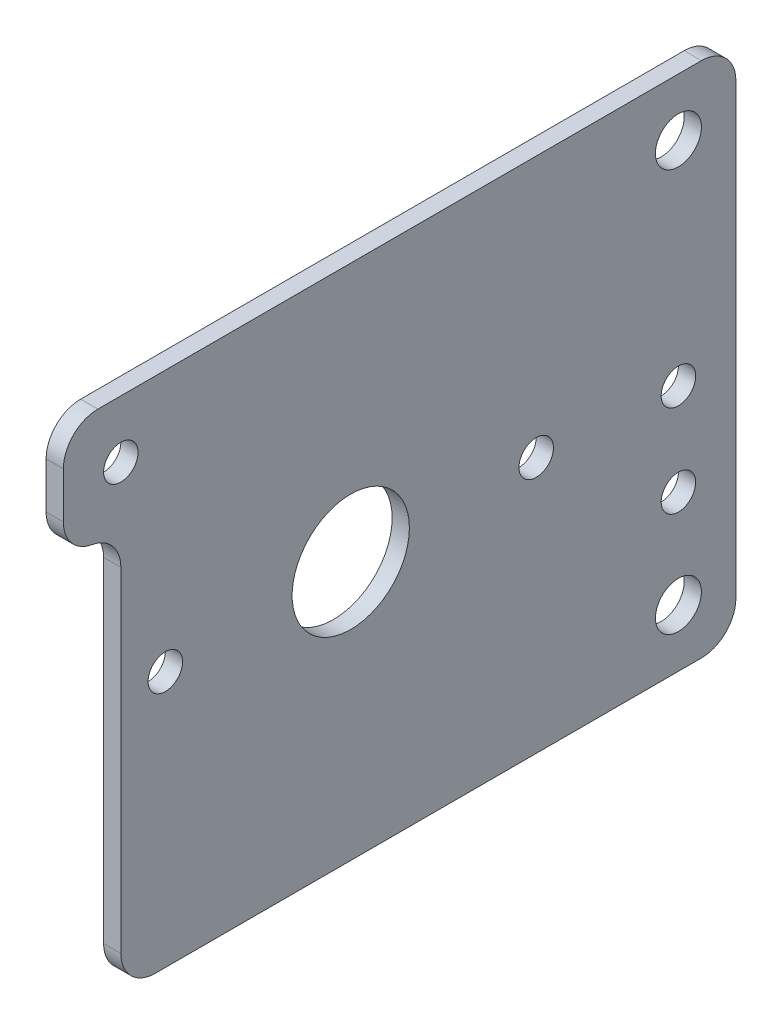
ISO-10303-21;
HEADER;
FILE_DESCRIPTION(('STEP AP214'),'2;1');
FILE_NAME('part.step','',(''),(''),'','','');
FILE_SCHEMA(('AUTOMOTIVE_DESIGN { 1 0 10303 214 1 1 1 1 }'));
ENDSEC;
DATA;
#1=APPLICATION_CONTEXT('core data for automotive mechanical design processes');
#2=APPLICATION_PROTOCOL_DEFINITION('international standard','automotive_design',2000,#1);
#3=PRODUCT_CONTEXT('',#1,'mechanical');
#4=PRODUCT('Part','Part','',(#3));
#5=PRODUCT_RELATED_PRODUCT_CATEGORY('part','',(#4));
#6=PRODUCT_DEFINITION_FORMATION('','',#4);
#7=PRODUCT_DEFINITION_CONTEXT('part definition',#1,'design');
#8=PRODUCT_DEFINITION('design','',#6,#7);
#9=PRODUCT_DEFINITION_SHAPE('','',#8);
#10=(LENGTH_UNIT() NAMED_UNIT(*) SI_UNIT(.MILLI.,.METRE.));
#11=(NAMED_UNIT(*) PLANE_ANGLE_UNIT() SI_UNIT($,.RADIAN.));
#12=(NAMED_UNIT(*) SI_UNIT($,.STERADIAN.) SOLID_ANGLE_UNIT());
#13=UNCERTAINTY_MEASURE_WITH_UNIT(LENGTH_MEASURE(1.E-05),#10,'distance_accuracy_value','');
#14=(GEOMETRIC_REPRESENTATION_CONTEXT(3) GLOBAL_UNCERTAINTY_ASSIGNED_CONTEXT((#13)) GLOBAL_UNIT_ASSIGNED_CONTEXT((#10,
#11,#12)) REPRESENTATION_CONTEXT('',''));
#15=CARTESIAN_POINT('',(0.,0.,0.));
#16=DIRECTION('',(0.,0.,1.));
#17=DIRECTION('',(1.,0.,0.));
#18=AXIS2_PLACEMENT_3D('',#15,#16,#17);
#19=CARTESIAN_POINT('',(1.5,-22.5,26.75));
#20=DIRECTION('',(0.,0.,-1.));
#21=DIRECTION('',(-1.,0.,0.));
#22=AXIS2_PLACEMENT_3D('',#19,#20,#21);
#23=PLANE('',#22);
#24=DIRECTION('',(0.,-1.,0.));
#25=VECTOR('',#24,1.);
#26=CARTESIAN_POINT('',(1.5,-22.5,26.75));
#27=LINE('',#26,#25);
#28=CARTESIAN_POINT('',(1.5,9.58392021690037,26.75));
#29=VERTEX_POINT('',#28);
#30=CARTESIAN_POINT('',(1.5,-19.5,26.75));
#31=VERTEX_POINT('',#30);
#32=EDGE_CURVE('E207',#29,#31,#27,.T.);
#33=ORIENTED_EDGE('',*,*,#32,.F.);
#34=DIRECTION('',(1.,0.,0.));
#35=VECTOR('',#34,1.);
#36=CARTESIAN_POINT('',(1.5,9.58392021690039,26.75));
#37=LINE('',#36,#35);
#38=CARTESIAN_POINT('',(0.,9.58392021690037,26.75));
#39=VERTEX_POINT('',#38);
#40=EDGE_CURVE('E56',#29,#39,#37,.F.);
#41=ORIENTED_EDGE('',*,*,#40,.T.);
#42=DIRECTION('',(0.,-1.,0.));
#43=VECTOR('',#42,1.);
#44=CARTESIAN_POINT('',(0.,-22.5,26.75));
#45=LINE('',#44,#43);
#46=CARTESIAN_POINT('',(0.,-19.5,26.75));
#47=VERTEX_POINT('',#46);
#48=EDGE_CURVE('E197',#39,#47,#45,.T.);
#49=ORIENTED_EDGE('',*,*,#48,.T.);
#50=DIRECTION('',(-1.,0.,0.));
#51=VECTOR('',#50,1.);
#52=CARTESIAN_POINT('',(1.5,-19.5,26.75));
#53=LINE('',#52,#51);
#54=EDGE_CURVE('E170',#47,#31,#53,.F.);
#55=ORIENTED_EDGE('',*,*,#54,.T.);
#56=EDGE_LOOP('',(#33,#41,#49,#55));
#57=FACE_BOUND('',#56,.T.);
#58=ADVANCED_FACE('F35',(#57),#23,.F.);
#59=CARTESIAN_POINT('',(1.5,0.,0.));
#60=DIRECTION('',(-1.,0.,0.));
#61=DIRECTION('',(0.,0.,1.));
#62=AXIS2_PLACEMENT_3D('',#59,#60,#61);
#63=PLANE('',#62);
#64=CARTESIAN_POINT('',(1.5,17.5,26.75));
#65=DIRECTION('',(1.,0.,0.));
#66=DIRECTION('',(0.,0.,-1.));
#67=AXIS2_PLACEMENT_3D('',#64,#65,#66);
#68=CIRCLE('',#67,1.5);
#69=CARTESIAN_POINT('',(1.5,17.5,25.25));
#70=VERTEX_POINT('',#69);
#71=EDGE_CURVE('E256',#70,#70,#68,.T.);
#72=ORIENTED_EDGE('',*,*,#71,.F.);
#73=EDGE_LOOP('',(#72));
#74=FACE_BOUND('',#73,.T.);
#75=DIRECTION('',(0.,-1.,0.));
#76=VECTOR('',#75,1.);
#77=CARTESIAN_POINT('',(1.5,12.5,31.75));
#78=LINE('',#77,#76);
#79=CARTESIAN_POINT('',(1.5,19.5,31.75));
#80=VERTEX_POINT('',#79);
#81=CARTESIAN_POINT('',(1.5,15.5,31.75));
#82=VERTEX_POINT('',#81);
#83=EDGE_CURVE('E124',#80,#82,#78,.T.);
#84=ORIENTED_EDGE('',*,*,#83,.T.);
#85=CARTESIAN_POINT('',(1.5,15.5,28.75));
#86=DIRECTION('',(-1.,0.,0.));
#87=DIRECTION('',(0.,0.,1.));
#88=AXIS2_PLACEMENT_3D('',#85,#86,#87);
#89=CIRCLE('',#88,3.);
#90=CARTESIAN_POINT('',(1.5,12.5419601084502,29.25));
#91=VERTEX_POINT('',#90);
#92=EDGE_CURVE('E150',#82,#91,#89,.F.);
#93=ORIENTED_EDGE('',*,*,#92,.T.);
#94=CARTESIAN_POINT('',(1.5,9.58392021690038,29.75));
#95=DIRECTION('',(-1.,0.,0.));
#96=DIRECTION('',(0.,0.,1.));
#97=AXIS2_PLACEMENT_3D('',#94,#95,#96);
#98=CIRCLE('',#97,3.);
#99=EDGE_CURVE('E43',#91,#29,#98,.T.);
#100=ORIENTED_EDGE('',*,*,#99,.T.);
#101=ORIENTED_EDGE('',*,*,#32,.T.);
#102=CARTESIAN_POINT('',(1.5,-19.5,23.75));
#103=DIRECTION('',(-1.,0.,0.));
#104=DIRECTION('',(0.,0.,1.));
#105=AXIS2_PLACEMENT_3D('',#102,#103,#104);
#106=CIRCLE('',#105,3.);
#107=CARTESIAN_POINT('',(1.5,-22.5,23.75));
#108=VERTEX_POINT('',#107);
#109=EDGE_CURVE('E184',#31,#108,#106,.F.);
#110=ORIENTED_EDGE('',*,*,#109,.T.);
#111=DIRECTION('',(0.,0.,-1.));
#112=VECTOR('',#111,1.);
#113=CARTESIAN_POINT('',(1.5,-22.5,26.75));
#114=LINE('',#113,#112);
#115=CARTESIAN_POINT('',(1.5,-22.5,-23.75));
#116=VERTEX_POINT('',#115);
#117=EDGE_CURVE('E128',#108,#116,#114,.T.);
#118=ORIENTED_EDGE('',*,*,#117,.T.);
#119=CARTESIAN_POINT('',(1.5,-19.5,-23.75));
#120=DIRECTION('',(-1.,0.,0.));
#121=DIRECTION('',(0.,0.,1.));
#122=AXIS2_PLACEMENT_3D('',#119,#120,#121);
#123=CIRCLE('',#122,3.);
#124=CARTESIAN_POINT('',(1.5,-19.5,-26.75));
#125=VERTEX_POINT('',#124);
#126=EDGE_CURVE('E190',#116,#125,#123,.F.);
#127=ORIENTED_EDGE('',*,*,#126,.T.);
#128=DIRECTION('',(0.,1.,0.));
#129=VECTOR('',#128,1.);
#130=CARTESIAN_POINT('',(1.5,-22.5,-26.75));
#131=LINE('',#130,#129);
#132=CARTESIAN_POINT('',(1.5,19.5,-26.75));
#133=VERTEX_POINT('',#132);
#134=EDGE_CURVE('E196',#125,#133,#131,.T.);
#135=ORIENTED_EDGE('',*,*,#134,.T.);
#136=CARTESIAN_POINT('',(1.5,19.5,-23.75));
#137=DIRECTION('',(-1.,0.,0.));
#138=DIRECTION('',(0.,0.,1.));
#139=AXIS2_PLACEMENT_3D('',#136,#137,#138);
#140=CIRCLE('',#139,3.);
#141=CARTESIAN_POINT('',(1.5,22.5,-23.75));
#142=VERTEX_POINT('',#141);
#143=EDGE_CURVE('E183',#133,#142,#140,.F.);
#144=ORIENTED_EDGE('',*,*,#143,.T.);
#145=DIRECTION('',(0.,0.,1.));
#146=VECTOR('',#145,1.);
#147=CARTESIAN_POINT('',(1.5,22.5,26.75));
#148=LINE('',#147,#146);
#149=CARTESIAN_POINT('',(1.5,22.5,28.75));
#150=VERTEX_POINT('',#149);
#151=EDGE_CURVE('E209',#142,#150,#148,.T.);
#152=ORIENTED_EDGE('',*,*,#151,.T.);
#153=CARTESIAN_POINT('',(1.5,19.5,28.75));
#154=DIRECTION('',(-1.,0.,0.));
#155=DIRECTION('',(0.,0.,1.));
#156=AXIS2_PLACEMENT_3D('',#153,#154,#155);
#157=CIRCLE('',#156,3.);
#158=EDGE_CURVE('E188',#150,#80,#157,.F.);
#159=ORIENTED_EDGE('',*,*,#158,.T.);
#160=EDGE_LOOP('',(#84,#93,#100,#101,#110,#118,#127,#135,#144,#152,#159));
#161=FACE_BOUND('',#160,.T.);
#162=CARTESIAN_POINT('',(1.5,0.,6.75000000000001));
#163=DIRECTION('',(1.,0.,0.));
#164=DIRECTION('',(0.,0.,-1.));
#165=AXIS2_PLACEMENT_3D('',#162,#163,#164);
#166=CIRCLE('',#165,5.1);
#167=CARTESIAN_POINT('',(1.5,0.,1.65));
#168=VERTEX_POINT('',#167);
#169=EDGE_CURVE('E204',#168,#168,#166,.T.);
#170=ORIENTED_EDGE('',*,*,#169,.F.);
#171=EDGE_LOOP('',(#170));
#172=FACE_BOUND('',#171,.T.);
#173=CARTESIAN_POINT('',(1.5,-0.210000000000023,22.88));
#174=DIRECTION('',(1.,0.,0.));
#175=DIRECTION('',(0.,0.,-1.));
#176=AXIS2_PLACEMENT_3D('',#173,#174,#175);
#177=CIRCLE('',#176,1.5);
#178=CARTESIAN_POINT('',(1.5,-0.210000000000023,21.38));
#179=VERTEX_POINT('',#178);
#180=EDGE_CURVE('E217',#179,#179,#177,.T.);
#181=ORIENTED_EDGE('',*,*,#180,.F.);
#182=EDGE_LOOP('',(#181));
#183=FACE_BOUND('',#182,.T.);
#184=CARTESIAN_POINT('',(1.5,-0.210000000000006,-9.38));
#185=DIRECTION('',(1.,0.,0.));
#186=DIRECTION('',(0.,0.,1.));
#187=AXIS2_PLACEMENT_3D('',#184,#185,#186);
#188=CIRCLE('',#187,1.5);
#189=CARTESIAN_POINT('',(1.5,-0.210000000000006,-7.87999999999999));
#190=VERTEX_POINT('',#189);
#191=EDGE_CURVE('E223',#190,#190,#188,.T.);
#192=ORIENTED_EDGE('',*,*,#191,.F.);
#193=EDGE_LOOP('',(#192));
#194=FACE_BOUND('',#193,.T.);
#195=CARTESIAN_POINT('',(1.5,17.5,-21.75));
#196=DIRECTION('',(1.,0.,0.));
#197=DIRECTION('',(0.,0.,-1.));
#198=AXIS2_PLACEMENT_3D('',#195,#196,#197);
#199=CIRCLE('',#198,2.00000000000001);
#200=CARTESIAN_POINT('',(1.5,17.5,-23.75));
#201=VERTEX_POINT('',#200);
#202=EDGE_CURVE('E229',#201,#201,#199,.T.);
#203=ORIENTED_EDGE('',*,*,#202,.F.);
#204=EDGE_LOOP('',(#203));
#205=FACE_BOUND('',#204,.T.);
#206=CARTESIAN_POINT('',(1.5,-17.5,-21.75));
#207=DIRECTION('',(1.,0.,0.));
#208=DIRECTION('',(0.,0.,1.));
#209=AXIS2_PLACEMENT_3D('',#206,#207,#208);
#210=CIRCLE('',#209,2.00000000000001);
#211=CARTESIAN_POINT('',(1.5,-17.5,-19.75));
#212=VERTEX_POINT('',#211);
#213=EDGE_CURVE('E235',#212,#212,#210,.T.);
#214=ORIENTED_EDGE('',*,*,#213,.F.);
#215=EDGE_LOOP('',(#214));
#216=FACE_BOUND('',#215,.T.);
#217=CARTESIAN_POINT('',(1.5,-0.999999999999997,-21.75));
#218=DIRECTION('',(1.,0.,0.));
#219=DIRECTION('',(0.,0.,-1.));
#220=AXIS2_PLACEMENT_3D('',#217,#218,#219);
#221=CIRCLE('',#220,1.5);
#222=CARTESIAN_POINT('',(1.5,-0.999999999999997,-23.25));
#223=VERTEX_POINT('',#222);
#224=EDGE_CURVE('E241',#223,#223,#221,.T.);
#225=ORIENTED_EDGE('',*,*,#224,.F.);
#226=EDGE_LOOP('',(#225));
#227=FACE_BOUND('',#226,.T.);
#228=CARTESIAN_POINT('',(1.5,-9.,-21.75));
#229=DIRECTION('',(1.,0.,0.));
#230=DIRECTION('',(0.,0.,-1.));
#231=AXIS2_PLACEMENT_3D('',#228,#229,#230);
#232=CIRCLE('',#231,1.5);
#233=CARTESIAN_POINT('',(1.5,-9.,-23.25));
#234=VERTEX_POINT('',#233);
#235=EDGE_CURVE('E247',#234,#234,#232,.T.);
#236=ORIENTED_EDGE('',*,*,#235,.F.);
#237=EDGE_LOOP('',(#236));
#238=FACE_BOUND('',#237,.T.);
#239=ADVANCED_FACE('F181',(#74,#161,#172,#183,#194,#205,#216,#227,#238),#63,.F.);
#240=CARTESIAN_POINT('',(0.,0.,0.));
#241=DIRECTION('',(-1.,0.,0.));
#242=DIRECTION('',(0.,0.,1.));
#243=AXIS2_PLACEMENT_3D('',#240,#241,#242);
#244=PLANE('',#243);
#245=CARTESIAN_POINT('',(0.,17.5,26.75));
#246=DIRECTION('',(1.,0.,0.));
#247=DIRECTION('',(0.,0.,-1.));
#248=AXIS2_PLACEMENT_3D('',#245,#246,#247);
#249=CIRCLE('',#248,1.5);
#250=CARTESIAN_POINT('',(0.,17.5,25.25));
#251=VERTEX_POINT('',#250);
#252=EDGE_CURVE('E255',#251,#251,#249,.T.);
#253=ORIENTED_EDGE('',*,*,#252,.T.);
#254=EDGE_LOOP('',(#253));
#255=FACE_BOUND('',#254,.T.);
#256=CARTESIAN_POINT('',(0.,-0.999999999999997,-21.75));
#257=DIRECTION('',(1.,0.,0.));
#258=DIRECTION('',(0.,0.,-1.));
#259=AXIS2_PLACEMENT_3D('',#256,#257,#258);
#260=CIRCLE('',#259,1.5);
#261=CARTESIAN_POINT('',(0.,-0.999999999999997,-23.25));
#262=VERTEX_POINT('',#261);
#263=EDGE_CURVE('E244',#262,#262,#260,.T.);
#264=ORIENTED_EDGE('',*,*,#263,.T.);
#265=EDGE_LOOP('',(#264));
#266=FACE_BOUND('',#265,.T.);
#267=CARTESIAN_POINT('',(0.,17.5,-21.75));
#268=DIRECTION('',(1.,0.,0.));
#269=DIRECTION('',(0.,0.,-1.));
#270=AXIS2_PLACEMENT_3D('',#267,#268,#269);
#271=CIRCLE('',#270,2.00000000000001);
#272=CARTESIAN_POINT('',(0.,17.5,-23.75));
#273=VERTEX_POINT('',#272);
#274=EDGE_CURVE('E232',#273,#273,#271,.T.);
#275=ORIENTED_EDGE('',*,*,#274,.T.);
#276=EDGE_LOOP('',(#275));
#277=FACE_BOUND('',#276,.T.);
#278=CARTESIAN_POINT('',(0.,-0.210000000000023,22.88));
#279=DIRECTION('',(1.,0.,0.));
#280=DIRECTION('',(0.,0.,-1.));
#281=AXIS2_PLACEMENT_3D('',#278,#279,#280);
#282=CIRCLE('',#281,1.5);
#283=CARTESIAN_POINT('',(0.,-0.210000000000023,21.38));
#284=VERTEX_POINT('',#283);
#285=EDGE_CURVE('E220',#284,#284,#282,.T.);
#286=ORIENTED_EDGE('',*,*,#285,.T.);
#287=EDGE_LOOP('',(#286));
#288=FACE_BOUND('',#287,.T.);
#289=ORIENTED_EDGE('',*,*,#48,.F.);
#290=CARTESIAN_POINT('',(0.,9.58392021690038,29.75));
#291=DIRECTION('',(-1.,0.,0.));
#292=DIRECTION('',(0.,0.,1.));
#293=AXIS2_PLACEMENT_3D('',#290,#291,#292);
#294=CIRCLE('',#293,3.);
#295=CARTESIAN_POINT('',(0.,12.5419601084502,29.25));
#296=VERTEX_POINT('',#295);
#297=EDGE_CURVE('E11',#39,#296,#294,.F.);
#298=ORIENTED_EDGE('',*,*,#297,.T.);
#299=CARTESIAN_POINT('',(0.,15.5,28.75));
#300=DIRECTION('',(-1.,0.,0.));
#301=DIRECTION('',(0.,0.,1.));
#302=AXIS2_PLACEMENT_3D('',#299,#300,#301);
#303=CIRCLE('',#302,3.);
#304=CARTESIAN_POINT('',(0.,15.5,31.75));
#305=VERTEX_POINT('',#304);
#306=EDGE_CURVE('E137',#296,#305,#303,.T.);
#307=ORIENTED_EDGE('',*,*,#306,.T.);
#308=DIRECTION('',(0.,-1.,0.));
#309=VECTOR('',#308,1.);
#310=CARTESIAN_POINT('',(0.,12.5,31.75));
#311=LINE('',#310,#309);
#312=CARTESIAN_POINT('',(0.,19.5,31.75));
#313=VERTEX_POINT('',#312);
#314=EDGE_CURVE('E121',#313,#305,#311,.T.);
#315=ORIENTED_EDGE('',*,*,#314,.F.);
#316=CARTESIAN_POINT('',(0.,19.5,28.75));
#317=DIRECTION('',(-1.,0.,0.));
#318=DIRECTION('',(0.,0.,1.));
#319=AXIS2_PLACEMENT_3D('',#316,#317,#318);
#320=CIRCLE('',#319,3.);
#321=CARTESIAN_POINT('',(0.,22.5,28.75));
#322=VERTEX_POINT('',#321);
#323=EDGE_CURVE('E134',#313,#322,#320,.T.);
#324=ORIENTED_EDGE('',*,*,#323,.T.);
#325=DIRECTION('',(0.,0.,1.));
#326=VECTOR('',#325,1.);
#327=CARTESIAN_POINT('',(0.,22.5,26.75));
#328=LINE('',#327,#326);
#329=CARTESIAN_POINT('',(0.,22.5,-23.75));
#330=VERTEX_POINT('',#329);
#331=EDGE_CURVE('E199',#330,#322,#328,.T.);
#332=ORIENTED_EDGE('',*,*,#331,.F.);
#333=CARTESIAN_POINT('',(0.,19.5,-23.75));
#334=DIRECTION('',(-1.,0.,0.));
#335=DIRECTION('',(0.,0.,1.));
#336=AXIS2_PLACEMENT_3D('',#333,#334,#335);
#337=CIRCLE('',#336,3.);
#338=CARTESIAN_POINT('',(0.,19.5,-26.75));
#339=VERTEX_POINT('',#338);
#340=EDGE_CURVE('E148',#330,#339,#337,.T.);
#341=ORIENTED_EDGE('',*,*,#340,.T.);
#342=DIRECTION('',(0.,1.,0.));
#343=VECTOR('',#342,1.);
#344=CARTESIAN_POINT('',(0.,-22.5,-26.75));
#345=LINE('',#344,#343);
#346=CARTESIAN_POINT('',(0.,-19.5,-26.75));
#347=VERTEX_POINT('',#346);
#348=EDGE_CURVE('E201',#347,#339,#345,.T.);
#349=ORIENTED_EDGE('',*,*,#348,.F.);
#350=CARTESIAN_POINT('',(0.,-19.5,-23.75));
#351=DIRECTION('',(-1.,0.,0.));
#352=DIRECTION('',(0.,0.,1.));
#353=AXIS2_PLACEMENT_3D('',#350,#351,#352);
#354=CIRCLE('',#353,3.);
#355=CARTESIAN_POINT('',(0.,-22.5,-23.75));
#356=VERTEX_POINT('',#355);
#357=EDGE_CURVE('E145',#347,#356,#354,.T.);
#358=ORIENTED_EDGE('',*,*,#357,.T.);
#359=DIRECTION('',(0.,0.,-1.));
#360=VECTOR('',#359,1.);
#361=CARTESIAN_POINT('',(0.,-22.5,26.75));
#362=LINE('',#361,#360);
#363=CARTESIAN_POINT('',(0.,-22.5,23.75));
#364=VERTEX_POINT('',#363);
#365=EDGE_CURVE('E193',#364,#356,#362,.T.);
#366=ORIENTED_EDGE('',*,*,#365,.F.);
#367=CARTESIAN_POINT('',(0.,-19.5,23.75));
#368=DIRECTION('',(-1.,0.,0.));
#369=DIRECTION('',(0.,0.,1.));
#370=AXIS2_PLACEMENT_3D('',#367,#368,#369);
#371=CIRCLE('',#370,3.);
#372=EDGE_CURVE('E144',#364,#47,#371,.T.);
#373=ORIENTED_EDGE('',*,*,#372,.T.);
#374=EDGE_LOOP('',(#289,#298,#307,#315,#324,#332,#341,#349,#358,#366,#373));
#375=FACE_BOUND('',#374,.T.);
#376=CARTESIAN_POINT('',(0.,0.,6.75000000000001));
#377=DIRECTION('',(1.,0.,0.));
#378=DIRECTION('',(0.,0.,-1.));
#379=AXIS2_PLACEMENT_3D('',#376,#377,#378);
#380=CIRCLE('',#379,5.1);
#381=CARTESIAN_POINT('',(0.,0.,1.65));
#382=VERTEX_POINT('',#381);
#383=EDGE_CURVE('E214',#382,#382,#380,.T.);
#384=ORIENTED_EDGE('',*,*,#383,.T.);
#385=EDGE_LOOP('',(#384));
#386=FACE_BOUND('',#385,.T.);
#387=CARTESIAN_POINT('',(0.,-0.210000000000006,-9.38));
#388=DIRECTION('',(1.,0.,0.));
#389=DIRECTION('',(0.,0.,1.));
#390=AXIS2_PLACEMENT_3D('',#387,#388,#389);
#391=CIRCLE('',#390,1.5);
#392=CARTESIAN_POINT('',(0.,-0.210000000000006,-7.87999999999999));
#393=VERTEX_POINT('',#392);
#394=EDGE_CURVE('E226',#393,#393,#391,.T.);
#395=ORIENTED_EDGE('',*,*,#394,.T.);
#396=EDGE_LOOP('',(#395));
#397=FACE_BOUND('',#396,.T.);
#398=CARTESIAN_POINT('',(0.,-17.5,-21.75));
#399=DIRECTION('',(1.,0.,0.));
#400=DIRECTION('',(0.,0.,1.));
#401=AXIS2_PLACEMENT_3D('',#398,#399,#400);
#402=CIRCLE('',#401,2.00000000000001);
#403=CARTESIAN_POINT('',(0.,-17.5,-19.75));
#404=VERTEX_POINT('',#403);
#405=EDGE_CURVE('E238',#404,#404,#402,.T.);
#406=ORIENTED_EDGE('',*,*,#405,.T.);
#407=EDGE_LOOP('',(#406));
#408=FACE_BOUND('',#407,.T.);
#409=CARTESIAN_POINT('',(0.,-9.,-21.75));
#410=DIRECTION('',(1.,0.,0.));
#411=DIRECTION('',(0.,0.,-1.));
#412=AXIS2_PLACEMENT_3D('',#409,#410,#411);
#413=CIRCLE('',#412,1.5);
#414=CARTESIAN_POINT('',(0.,-9.,-23.25));
#415=VERTEX_POINT('',#414);
#416=EDGE_CURVE('E138',#415,#415,#413,.T.);
#417=ORIENTED_EDGE('',*,*,#416,.T.);
#418=EDGE_LOOP('',(#417));
#419=FACE_BOUND('',#418,.T.);
#420=ADVANCED_FACE('F131',(#255,#266,#277,#288,#375,#386,#397,#408,#419),#244,.T.);
#421=CARTESIAN_POINT('',(1.5,-22.5,-26.75));
#422=DIRECTION('',(0.,0.,1.));
#423=DIRECTION('',(1.,0.,0.));
#424=AXIS2_PLACEMENT_3D('',#421,#422,#423);
#425=PLANE('',#424);
#426=ORIENTED_EDGE('',*,*,#348,.T.);
#427=DIRECTION('',(-1.,0.,0.));
#428=VECTOR('',#427,1.);
#429=CARTESIAN_POINT('',(1.5,19.5,-26.75));
#430=LINE('',#429,#428);
#431=EDGE_CURVE('E163',#339,#133,#430,.F.);
#432=ORIENTED_EDGE('',*,*,#431,.T.);
#433=ORIENTED_EDGE('',*,*,#134,.F.);
#434=DIRECTION('',(-1.,0.,0.));
#435=VECTOR('',#434,1.);
#436=CARTESIAN_POINT('',(1.5,-19.5,-26.75));
#437=LINE('',#436,#435);
#438=EDGE_CURVE('E160',#125,#347,#437,.T.);
#439=ORIENTED_EDGE('',*,*,#438,.T.);
#440=EDGE_LOOP('',(#426,#432,#433,#439));
#441=FACE_BOUND('',#440,.T.);
#442=ADVANCED_FACE('F276',(#441),#425,.F.);
#443=CARTESIAN_POINT('',(1.5,22.5,26.75));
#444=DIRECTION('',(0.,-1.,0.));
#445=DIRECTION('',(0.,0.,-1.));
#446=AXIS2_PLACEMENT_3D('',#443,#444,#445);
#447=PLANE('',#446);
#448=ORIENTED_EDGE('',*,*,#151,.F.);
#449=DIRECTION('',(-1.,0.,0.));
#450=VECTOR('',#449,1.);
#451=CARTESIAN_POINT('',(1.5,22.5,-23.75));
#452=LINE('',#451,#450);
#453=EDGE_CURVE('E157',#142,#330,#452,.T.);
#454=ORIENTED_EDGE('',*,*,#453,.T.);
#455=ORIENTED_EDGE('',*,*,#331,.T.);
#456=DIRECTION('',(1.,0.,0.));
#457=VECTOR('',#456,1.);
#458=CARTESIAN_POINT('',(1.5,22.5,28.75));
#459=LINE('',#458,#457);
#460=EDGE_CURVE('E143',#322,#150,#459,.T.);
#461=ORIENTED_EDGE('',*,*,#460,.T.);
#462=EDGE_LOOP('',(#448,#454,#455,#461));
#463=FACE_BOUND('',#462,.T.);
#464=ADVANCED_FACE('F285',(#463),#447,.F.);
#465=CARTESIAN_POINT('',(1.5,-22.5,26.75));
#466=DIRECTION('',(0.,1.,0.));
#467=DIRECTION('',(0.,0.,1.));
#468=AXIS2_PLACEMENT_3D('',#465,#466,#467);
#469=PLANE('',#468);
#470=ORIENTED_EDGE('',*,*,#117,.F.);
#471=DIRECTION('',(-1.,0.,0.));
#472=VECTOR('',#471,1.);
#473=CARTESIAN_POINT('',(1.5,-22.5,23.75));
#474=LINE('',#473,#472);
#475=EDGE_CURVE('E167',#108,#364,#474,.T.);
#476=ORIENTED_EDGE('',*,*,#475,.T.);
#477=ORIENTED_EDGE('',*,*,#365,.T.);
#478=DIRECTION('',(-1.,0.,0.));
#479=VECTOR('',#478,1.);
#480=CARTESIAN_POINT('',(1.5,-22.5,-23.75));
#481=LINE('',#480,#479);
#482=EDGE_CURVE('E165',#356,#116,#481,.F.);
#483=ORIENTED_EDGE('',*,*,#482,.T.);
#484=EDGE_LOOP('',(#470,#476,#477,#483));
#485=FACE_BOUND('',#484,.T.);
#486=ADVANCED_FACE('F283',(#485),#469,.F.);
#487=CARTESIAN_POINT('',(1.5,0.,6.75000000000001));
#488=DIRECTION('',(-1.,0.,0.));
#489=DIRECTION('',(0.,0.,1.));
#490=AXIS2_PLACEMENT_3D('',#487,#488,#489);
#491=CYLINDRICAL_SURFACE('',#490,5.1);
#492=ORIENTED_EDGE('',*,*,#169,.T.);
#493=EDGE_LOOP('',(#492));
#494=FACE_BOUND('',#493,.T.);
#495=ORIENTED_EDGE('',*,*,#383,.F.);
#496=EDGE_LOOP('',(#495));
#497=FACE_BOUND('',#496,.T.);
#498=ADVANCED_FACE('F280',(#494,#497),#491,.F.);
#499=CARTESIAN_POINT('',(1.5,-0.210000000000023,22.88));
#500=DIRECTION('',(-1.,0.,0.));
#501=DIRECTION('',(0.,0.,1.));
#502=AXIS2_PLACEMENT_3D('',#499,#500,#501);
#503=CYLINDRICAL_SURFACE('',#502,1.5);
#504=ORIENTED_EDGE('',*,*,#180,.T.);
#505=EDGE_LOOP('',(#504));
#506=FACE_BOUND('',#505,.T.);
#507=ORIENTED_EDGE('',*,*,#285,.F.);
#508=EDGE_LOOP('',(#507));
#509=FACE_BOUND('',#508,.T.);
#510=ADVANCED_FACE('F458',(#506,#509),#503,.F.);
#511=CARTESIAN_POINT('',(1.5,-0.210000000000006,-9.38));
#512=DIRECTION('',(-1.,0.,0.));
#513=DIRECTION('',(0.,0.,1.));
#514=AXIS2_PLACEMENT_3D('',#511,#512,#513);
#515=CYLINDRICAL_SURFACE('',#514,1.5);
#516=ORIENTED_EDGE('',*,*,#191,.T.);
#517=EDGE_LOOP('',(#516));
#518=FACE_BOUND('',#517,.T.);
#519=ORIENTED_EDGE('',*,*,#394,.F.);
#520=EDGE_LOOP('',(#519));
#521=FACE_BOUND('',#520,.T.);
#522=ADVANCED_FACE('F448',(#518,#521),#515,.F.);
#523=CARTESIAN_POINT('',(1.5,17.5,-21.75));
#524=DIRECTION('',(-1.,0.,0.));
#525=DIRECTION('',(0.,0.,1.));
#526=AXIS2_PLACEMENT_3D('',#523,#524,#525);
#527=CYLINDRICAL_SURFACE('',#526,2.00000000000001);
#528=ORIENTED_EDGE('',*,*,#202,.T.);
#529=EDGE_LOOP('',(#528));
#530=FACE_BOUND('',#529,.T.);
#531=ORIENTED_EDGE('',*,*,#274,.F.);
#532=EDGE_LOOP('',(#531));
#533=FACE_BOUND('',#532,.T.);
#534=ADVANCED_FACE('F438',(#530,#533),#527,.F.);
#535=CARTESIAN_POINT('',(1.5,-17.5,-21.75));
#536=DIRECTION('',(-1.,0.,0.));
#537=DIRECTION('',(0.,0.,1.));
#538=AXIS2_PLACEMENT_3D('',#535,#536,#537);
#539=CYLINDRICAL_SURFACE('',#538,2.00000000000001);
#540=ORIENTED_EDGE('',*,*,#213,.T.);
#541=EDGE_LOOP('',(#540));
#542=FACE_BOUND('',#541,.T.);
#543=ORIENTED_EDGE('',*,*,#405,.F.);
#544=EDGE_LOOP('',(#543));
#545=FACE_BOUND('',#544,.T.);
#546=ADVANCED_FACE('F428',(#542,#545),#539,.F.);
#547=CARTESIAN_POINT('',(1.5,-0.999999999999997,-21.75));
#548=DIRECTION('',(-1.,0.,0.));
#549=DIRECTION('',(0.,0.,1.));
#550=AXIS2_PLACEMENT_3D('',#547,#548,#549);
#551=CYLINDRICAL_SURFACE('',#550,1.5);
#552=ORIENTED_EDGE('',*,*,#224,.T.);
#553=EDGE_LOOP('',(#552));
#554=FACE_BOUND('',#553,.T.);
#555=ORIENTED_EDGE('',*,*,#263,.F.);
#556=EDGE_LOOP('',(#555));
#557=FACE_BOUND('',#556,.T.);
#558=ADVANCED_FACE('F418',(#554,#557),#551,.F.);
#559=CARTESIAN_POINT('',(1.5,-9.,-21.75));
#560=DIRECTION('',(-1.,0.,0.));
#561=DIRECTION('',(0.,0.,1.));
#562=AXIS2_PLACEMENT_3D('',#559,#560,#561);
#563=CYLINDRICAL_SURFACE('',#562,1.5);
#564=ORIENTED_EDGE('',*,*,#235,.T.);
#565=EDGE_LOOP('',(#564));
#566=FACE_BOUND('',#565,.T.);
#567=ORIENTED_EDGE('',*,*,#416,.F.);
#568=EDGE_LOOP('',(#567));
#569=FACE_BOUND('',#568,.T.);
#570=ADVANCED_FACE('F385',(#566,#569),#563,.F.);
#571=CARTESIAN_POINT('',(-11.180339887499,12.5,31.75));
#572=DIRECTION('',(0.,0.,1.));
#573=DIRECTION('',(1.,0.,0.));
#574=AXIS2_PLACEMENT_3D('',#571,#572,#573);
#575=PLANE('',#574);
#576=ORIENTED_EDGE('',*,*,#314,.T.);
#577=DIRECTION('',(1.,0.,0.));
#578=VECTOR('',#577,1.);
#579=CARTESIAN_POINT('',(-11.180339887499,15.5,31.75));
#580=LINE('',#579,#578);
#581=EDGE_CURVE('E127',#305,#82,#580,.T.);
#582=ORIENTED_EDGE('',*,*,#581,.T.);
#583=ORIENTED_EDGE('',*,*,#83,.F.);
#584=DIRECTION('',(1.,0.,0.));
#585=VECTOR('',#584,1.);
#586=CARTESIAN_POINT('',(0.,19.5,31.75));
#587=LINE('',#586,#585);
#588=EDGE_CURVE('E117',#80,#313,#587,.F.);
#589=ORIENTED_EDGE('',*,*,#588,.T.);
#590=EDGE_LOOP('',(#576,#582,#583,#589));
#591=FACE_BOUND('',#590,.T.);
#592=ADVANCED_FACE('F119',(#591),#575,.T.);
#593=CARTESIAN_POINT('',(0.,17.5,26.75));
#594=DIRECTION('',(1.,0.,0.));
#595=DIRECTION('',(0.,0.,-1.));
#596=AXIS2_PLACEMENT_3D('',#593,#594,#595);
#597=CYLINDRICAL_SURFACE('',#596,1.5);
#598=ORIENTED_EDGE('',*,*,#252,.F.);
#599=EDGE_LOOP('',(#598));
#600=FACE_BOUND('',#599,.T.);
#601=ORIENTED_EDGE('',*,*,#71,.T.);
#602=EDGE_LOOP('',(#601));
#603=FACE_BOUND('',#602,.T.);
#604=ADVANCED_FACE('F264',(#600,#603),#597,.F.);
#605=CARTESIAN_POINT('',(-11.180339887499,15.5,28.75));
#606=DIRECTION('',(1.,0.,0.));
#607=DIRECTION('',(0.,0.,-1.));
#608=AXIS2_PLACEMENT_3D('',#605,#606,#607);
#609=CYLINDRICAL_SURFACE('',#608,3.);
#610=ORIENTED_EDGE('',*,*,#306,.F.);
#611=DIRECTION('',(1.,0.,0.));
#612=VECTOR('',#611,1.);
#613=CARTESIAN_POINT('',(-11.180339887499,12.5419601084502,29.25));
#614=LINE('',#613,#612);
#615=EDGE_CURVE('E173',#296,#91,#614,.T.);
#616=ORIENTED_EDGE('',*,*,#615,.T.);
#617=ORIENTED_EDGE('',*,*,#92,.F.);
#618=ORIENTED_EDGE('',*,*,#581,.F.);
#619=EDGE_LOOP('',(#610,#616,#617,#618));
#620=FACE_BOUND('',#619,.T.);
#621=ADVANCED_FACE('F178',(#620),#609,.T.);
#622=CARTESIAN_POINT('',(1.5,19.5,-23.75));
#623=DIRECTION('',(-1.,0.,0.));
#624=DIRECTION('',(0.,0.,1.));
#625=AXIS2_PLACEMENT_3D('',#622,#623,#624);
#626=CYLINDRICAL_SURFACE('',#625,3.);
#627=ORIENTED_EDGE('',*,*,#143,.F.);
#628=ORIENTED_EDGE('',*,*,#431,.F.);
#629=ORIENTED_EDGE('',*,*,#340,.F.);
#630=ORIENTED_EDGE('',*,*,#453,.F.);
#631=EDGE_LOOP('',(#627,#628,#629,#630));
#632=FACE_BOUND('',#631,.T.);
#633=ADVANCED_FACE('F296',(#632),#626,.T.);
#634=CARTESIAN_POINT('',(1.5,-19.5,23.75));
#635=DIRECTION('',(-1.,0.,0.));
#636=DIRECTION('',(0.,0.,1.));
#637=AXIS2_PLACEMENT_3D('',#634,#635,#636);
#638=CYLINDRICAL_SURFACE('',#637,3.);
#639=ORIENTED_EDGE('',*,*,#109,.F.);
#640=ORIENTED_EDGE('',*,*,#54,.F.);
#641=ORIENTED_EDGE('',*,*,#372,.F.);
#642=ORIENTED_EDGE('',*,*,#475,.F.);
#643=EDGE_LOOP('',(#639,#640,#641,#642));
#644=FACE_BOUND('',#643,.T.);
#645=ADVANCED_FACE('F299',(#644),#638,.T.);
#646=CARTESIAN_POINT('',(1.5,19.5,28.75));
#647=DIRECTION('',(-1.,0.,0.));
#648=DIRECTION('',(0.,0.,1.));
#649=AXIS2_PLACEMENT_3D('',#646,#647,#648);
#650=CYLINDRICAL_SURFACE('',#649,3.);
#651=ORIENTED_EDGE('',*,*,#323,.F.);
#652=ORIENTED_EDGE('',*,*,#588,.F.);
#653=ORIENTED_EDGE('',*,*,#158,.F.);
#654=ORIENTED_EDGE('',*,*,#460,.F.);
#655=EDGE_LOOP('',(#651,#652,#653,#654));
#656=FACE_BOUND('',#655,.T.);
#657=ADVANCED_FACE('F141',(#656),#650,.T.);
#658=CARTESIAN_POINT('',(1.5,-19.5,-23.75));
#659=DIRECTION('',(-1.,0.,0.));
#660=DIRECTION('',(0.,0.,1.));
#661=AXIS2_PLACEMENT_3D('',#658,#659,#660);
#662=CYLINDRICAL_SURFACE('',#661,3.);
#663=ORIENTED_EDGE('',*,*,#126,.F.);
#664=ORIENTED_EDGE('',*,*,#482,.F.);
#665=ORIENTED_EDGE('',*,*,#357,.F.);
#666=ORIENTED_EDGE('',*,*,#438,.F.);
#667=EDGE_LOOP('',(#663,#664,#665,#666));
#668=FACE_BOUND('',#667,.T.);
#669=ADVANCED_FACE('F305',(#668),#662,.T.);
#670=CARTESIAN_POINT('',(-11.180339887499,9.58392021690038,29.75));
#671=DIRECTION('',(1.,0.,0.));
#672=DIRECTION('',(0.,0.,-1.));
#673=AXIS2_PLACEMENT_3D('',#670,#671,#672);
#674=CYLINDRICAL_SURFACE('',#673,3.);
#675=ORIENTED_EDGE('',*,*,#297,.F.);
#676=ORIENTED_EDGE('',*,*,#40,.F.);
#677=ORIENTED_EDGE('',*,*,#99,.F.);
#678=ORIENTED_EDGE('',*,*,#615,.F.);
#679=EDGE_LOOP('',(#675,#676,#677,#678));
#680=FACE_BOUND('',#679,.T.);
#681=ADVANCED_FACE('F37',(#680),#674,.F.);
#682=CLOSED_SHELL('',(#58,#239,#420,#442,#464,#486,#498,#510,#522,#534,#546,#558,#570,#592,#604,
#621,#633,#645,#657,#669,#681));
#683=MANIFOLD_SOLID_BREP('B2',#682);
#684=ADVANCED_BREP_SHAPE_REPRESENTATION('',(#18,#683),#14);
#685=SHAPE_DEFINITION_REPRESENTATION(#9,#684);
ENDSEC;
END-ISO-10303-21;
